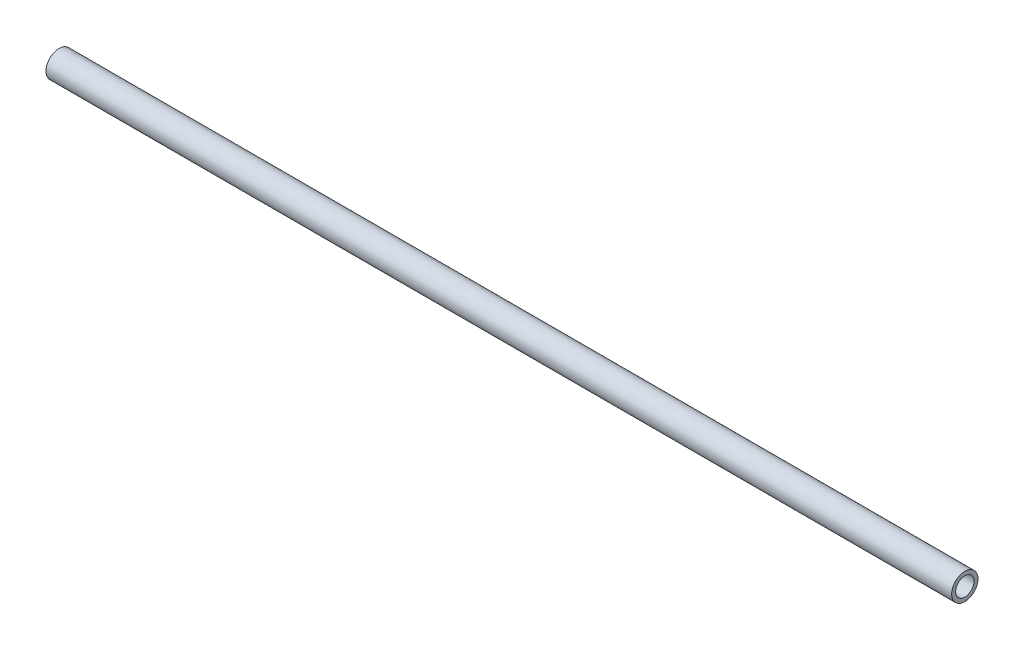
ISO-10303-21;
HEADER;
FILE_DESCRIPTION(('STEP AP214'),'2;1');
FILE_NAME('part.step','',(''),(''),'','','');
FILE_SCHEMA(('AUTOMOTIVE_DESIGN { 1 0 10303 214 1 1 1 1 }'));
ENDSEC;
DATA;
#1=APPLICATION_CONTEXT('core data for automotive mechanical design processes');
#2=APPLICATION_PROTOCOL_DEFINITION('international standard','automotive_design',2000,#1);
#3=PRODUCT_CONTEXT('',#1,'mechanical');
#4=PRODUCT('Part','Part','',(#3));
#5=PRODUCT_RELATED_PRODUCT_CATEGORY('part','',(#4));
#6=PRODUCT_DEFINITION_FORMATION('','',#4);
#7=PRODUCT_DEFINITION_CONTEXT('part definition',#1,'design');
#8=PRODUCT_DEFINITION('design','',#6,#7);
#9=PRODUCT_DEFINITION_SHAPE('','',#8);
#10=(LENGTH_UNIT() NAMED_UNIT(*) SI_UNIT(.MILLI.,.METRE.));
#11=(NAMED_UNIT(*) PLANE_ANGLE_UNIT() SI_UNIT($,.RADIAN.));
#12=(NAMED_UNIT(*) SI_UNIT($,.STERADIAN.) SOLID_ANGLE_UNIT());
#13=UNCERTAINTY_MEASURE_WITH_UNIT(LENGTH_MEASURE(1.E-05),#10,'distance_accuracy_value','');
#14=(GEOMETRIC_REPRESENTATION_CONTEXT(3) GLOBAL_UNCERTAINTY_ASSIGNED_CONTEXT((#13)) GLOBAL_UNIT_ASSIGNED_CONTEXT((#10,
#11,#12)) REPRESENTATION_CONTEXT('',''));
#15=CARTESIAN_POINT('',(0.,0.,0.));
#16=DIRECTION('',(0.,0.,1.));
#17=DIRECTION('',(1.,0.,0.));
#18=AXIS2_PLACEMENT_3D('',#15,#16,#17);
#19=CARTESIAN_POINT('',(1092.2,0.,0.));
#20=DIRECTION('',(1.,0.,0.));
#21=DIRECTION('',(0.,0.,-1.));
#22=AXIS2_PLACEMENT_3D('',#19,#20,#21);
#23=PLANE('',#22);
#24=CARTESIAN_POINT('',(1092.2,0.,0.));
#25=DIRECTION('',(1.,0.,0.));
#26=DIRECTION('',(0.,0.,-1.));
#27=AXIS2_PLACEMENT_3D('',#24,#25,#26);
#28=CIRCLE('',#27,15.875);
#29=CARTESIAN_POINT('',(1092.2,0.,-15.875));
#30=VERTEX_POINT('',#29);
#31=EDGE_CURVE('E10',#30,#30,#28,.T.);
#32=ORIENTED_EDGE('',*,*,#31,.T.);
#33=EDGE_LOOP('',(#32));
#34=FACE_BOUND('',#33,.T.);
#35=CARTESIAN_POINT('',(1092.2,0.,0.));
#36=DIRECTION('',(1.,0.,0.));
#37=DIRECTION('',(0.,0.,-1.));
#38=AXIS2_PLACEMENT_3D('',#35,#36,#37);
#39=CIRCLE('',#38,11.1125);
#40=CARTESIAN_POINT('',(1092.2,0.,-11.1125));
#41=VERTEX_POINT('',#40);
#42=EDGE_CURVE('E42',#41,#41,#39,.T.);
#43=ORIENTED_EDGE('',*,*,#42,.F.);
#44=EDGE_LOOP('',(#43));
#45=FACE_BOUND('',#44,.T.);
#46=ADVANCED_FACE('F31',(#34,#45),#23,.T.);
#47=CARTESIAN_POINT('',(0.,0.,0.));
#48=DIRECTION('',(1.,0.,0.));
#49=DIRECTION('',(0.,0.,-1.));
#50=AXIS2_PLACEMENT_3D('',#47,#48,#49);
#51=PLANE('',#50);
#52=CARTESIAN_POINT('',(0.,0.,0.));
#53=DIRECTION('',(1.,0.,0.));
#54=DIRECTION('',(0.,0.,-1.));
#55=AXIS2_PLACEMENT_3D('',#52,#53,#54);
#56=CIRCLE('',#55,15.875);
#57=CARTESIAN_POINT('',(0.,0.,-15.875));
#58=VERTEX_POINT('',#57);
#59=EDGE_CURVE('E35',#58,#58,#56,.T.);
#60=ORIENTED_EDGE('',*,*,#59,.F.);
#61=EDGE_LOOP('',(#60));
#62=FACE_BOUND('',#61,.T.);
#63=CARTESIAN_POINT('',(0.,0.,0.));
#64=DIRECTION('',(1.,0.,0.));
#65=DIRECTION('',(0.,0.,-1.));
#66=AXIS2_PLACEMENT_3D('',#63,#64,#65);
#67=CIRCLE('',#66,11.1125);
#68=CARTESIAN_POINT('',(0.,0.,-11.1125));
#69=VERTEX_POINT('',#68);
#70=EDGE_CURVE('E44',#69,#69,#67,.T.);
#71=ORIENTED_EDGE('',*,*,#70,.T.);
#72=EDGE_LOOP('',(#71));
#73=FACE_BOUND('',#72,.T.);
#74=ADVANCED_FACE('F54',(#62,#73),#51,.F.);
#75=CARTESIAN_POINT('',(1092.2,0.,0.));
#76=DIRECTION('',(-1.,0.,0.));
#77=DIRECTION('',(0.,0.,1.));
#78=AXIS2_PLACEMENT_3D('',#75,#76,#77);
#79=CYLINDRICAL_SURFACE('',#78,15.875);
#80=ORIENTED_EDGE('',*,*,#31,.F.);
#81=EDGE_LOOP('',(#80));
#82=FACE_BOUND('',#81,.T.);
#83=ORIENTED_EDGE('',*,*,#59,.T.);
#84=EDGE_LOOP('',(#83));
#85=FACE_BOUND('',#84,.T.);
#86=ADVANCED_FACE('F33',(#82,#85),#79,.T.);
#87=CARTESIAN_POINT('',(1092.2,0.,0.));
#88=DIRECTION('',(-1.,0.,0.));
#89=DIRECTION('',(0.,0.,1.));
#90=AXIS2_PLACEMENT_3D('',#87,#88,#89);
#91=CYLINDRICAL_SURFACE('',#90,11.1125);
#92=ORIENTED_EDGE('',*,*,#42,.T.);
#93=EDGE_LOOP('',(#92));
#94=FACE_BOUND('',#93,.T.);
#95=ORIENTED_EDGE('',*,*,#70,.F.);
#96=EDGE_LOOP('',(#95));
#97=FACE_BOUND('',#96,.T.);
#98=ADVANCED_FACE('F50',(#94,#97),#91,.F.);
#99=CLOSED_SHELL('',(#46,#74,#86,#98));
#100=MANIFOLD_SOLID_BREP('B2',#99);
#101=ADVANCED_BREP_SHAPE_REPRESENTATION('',(#18,#100),#14);
#102=SHAPE_DEFINITION_REPRESENTATION(#9,#101);
ENDSEC;
END-ISO-10303-21;
